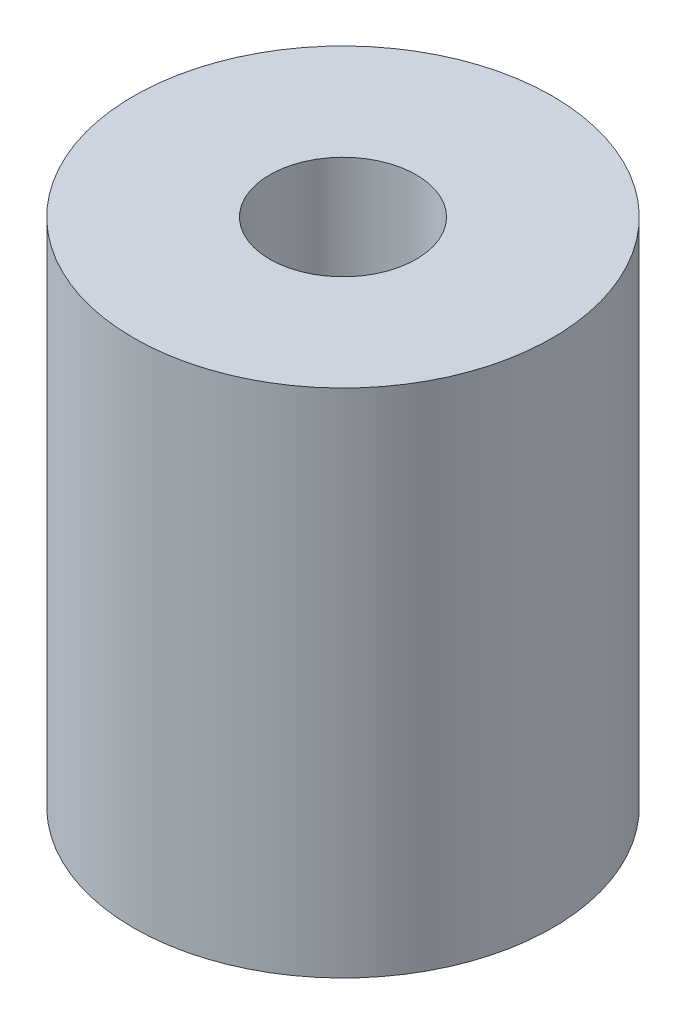
ISO-10303-21;
HEADER;
FILE_DESCRIPTION(('STEP AP214'),'2;1');
FILE_NAME('part.step','',(''),(''),'','','');
FILE_SCHEMA(('AUTOMOTIVE_DESIGN { 1 0 10303 214 1 1 1 1 }'));
ENDSEC;
DATA;
#1=APPLICATION_CONTEXT('core data for automotive mechanical design processes');
#2=APPLICATION_PROTOCOL_DEFINITION('international standard','automotive_design',2000,#1);
#3=PRODUCT_CONTEXT('',#1,'mechanical');
#4=PRODUCT('Part','Part','',(#3));
#5=PRODUCT_RELATED_PRODUCT_CATEGORY('part','',(#4));
#6=PRODUCT_DEFINITION_FORMATION('','',#4);
#7=PRODUCT_DEFINITION_CONTEXT('part definition',#1,'design');
#8=PRODUCT_DEFINITION('design','',#6,#7);
#9=PRODUCT_DEFINITION_SHAPE('','',#8);
#10=(LENGTH_UNIT() NAMED_UNIT(*) SI_UNIT(.MILLI.,.METRE.));
#11=(NAMED_UNIT(*) PLANE_ANGLE_UNIT() SI_UNIT($,.RADIAN.));
#12=(NAMED_UNIT(*) SI_UNIT($,.STERADIAN.) SOLID_ANGLE_UNIT());
#13=UNCERTAINTY_MEASURE_WITH_UNIT(LENGTH_MEASURE(1.E-05),#10,'distance_accuracy_value','');
#14=(GEOMETRIC_REPRESENTATION_CONTEXT(3) GLOBAL_UNCERTAINTY_ASSIGNED_CONTEXT((#13)) GLOBAL_UNIT_ASSIGNED_CONTEXT((#10,
#11,#12)) REPRESENTATION_CONTEXT('',''));
#15=CARTESIAN_POINT('',(0.,0.,0.));
#16=DIRECTION('',(0.,0.,1.));
#17=DIRECTION('',(1.,0.,0.));
#18=AXIS2_PLACEMENT_3D('',#15,#16,#17);
#19=CARTESIAN_POINT('',(0.,15.,0.));
#20=DIRECTION('',(0.,1.,0.));
#21=DIRECTION('',(0.,0.,1.));
#22=AXIS2_PLACEMENT_3D('',#19,#20,#21);
#23=PLANE('',#22);
#24=CARTESIAN_POINT('',(0.,15.,0.));
#25=DIRECTION('',(0.,1.,0.));
#26=DIRECTION('',(0.,0.,1.));
#27=AXIS2_PLACEMENT_3D('',#24,#25,#26);
#28=CIRCLE('',#27,6.15);
#29=CARTESIAN_POINT('',(0.,15.,6.15));
#30=VERTEX_POINT('',#29);
#31=EDGE_CURVE('E10',#30,#30,#28,.T.);
#32=ORIENTED_EDGE('',*,*,#31,.T.);
#33=EDGE_LOOP('',(#32));
#34=FACE_BOUND('',#33,.T.);
#35=CARTESIAN_POINT('',(0.,15.,0.));
#36=DIRECTION('',(0.,1.,0.));
#37=DIRECTION('',(0.,0.,1.));
#38=AXIS2_PLACEMENT_3D('',#35,#36,#37);
#39=CIRCLE('',#38,2.15);
#40=CARTESIAN_POINT('',(0.,15.,2.15));
#41=VERTEX_POINT('',#40);
#42=EDGE_CURVE('E45',#41,#41,#39,.T.);
#43=ORIENTED_EDGE('',*,*,#42,.F.);
#44=EDGE_LOOP('',(#43));
#45=FACE_BOUND('',#44,.T.);
#46=ADVANCED_FACE('F34',(#34,#45),#23,.T.);
#47=CARTESIAN_POINT('',(0.,0.,0.));
#48=DIRECTION('',(0.,1.,0.));
#49=DIRECTION('',(0.,0.,1.));
#50=AXIS2_PLACEMENT_3D('',#47,#48,#49);
#51=PLANE('',#50);
#52=CARTESIAN_POINT('',(0.,0.,0.));
#53=DIRECTION('',(0.,1.,0.));
#54=DIRECTION('',(0.,0.,1.));
#55=AXIS2_PLACEMENT_3D('',#52,#53,#54);
#56=CIRCLE('',#55,6.15);
#57=CARTESIAN_POINT('',(0.,0.,6.15));
#58=VERTEX_POINT('',#57);
#59=EDGE_CURVE('E38',#58,#58,#56,.T.);
#60=ORIENTED_EDGE('',*,*,#59,.F.);
#61=EDGE_LOOP('',(#60));
#62=FACE_BOUND('',#61,.T.);
#63=CARTESIAN_POINT('',(0.,0.,0.));
#64=DIRECTION('',(0.,1.,0.));
#65=DIRECTION('',(0.,0.,1.));
#66=AXIS2_PLACEMENT_3D('',#63,#64,#65);
#67=CIRCLE('',#66,2.15);
#68=CARTESIAN_POINT('',(0.,0.,2.15));
#69=VERTEX_POINT('',#68);
#70=EDGE_CURVE('E47',#69,#69,#67,.T.);
#71=ORIENTED_EDGE('',*,*,#70,.T.);
#72=EDGE_LOOP('',(#71));
#73=FACE_BOUND('',#72,.T.);
#74=ADVANCED_FACE('F57',(#62,#73),#51,.F.);
#75=CARTESIAN_POINT('',(0.,15.,0.));
#76=DIRECTION('',(0.,-1.,0.));
#77=DIRECTION('',(0.,0.,-1.));
#78=AXIS2_PLACEMENT_3D('',#75,#76,#77);
#79=CYLINDRICAL_SURFACE('',#78,6.15);
#80=ORIENTED_EDGE('',*,*,#31,.F.);
#81=EDGE_LOOP('',(#80));
#82=FACE_BOUND('',#81,.T.);
#83=ORIENTED_EDGE('',*,*,#59,.T.);
#84=EDGE_LOOP('',(#83));
#85=FACE_BOUND('',#84,.T.);
#86=ADVANCED_FACE('F36',(#82,#85),#79,.T.);
#87=CARTESIAN_POINT('',(0.,15.,0.));
#88=DIRECTION('',(0.,-1.,0.));
#89=DIRECTION('',(0.,0.,-1.));
#90=AXIS2_PLACEMENT_3D('',#87,#88,#89);
#91=CYLINDRICAL_SURFACE('',#90,2.15);
#92=ORIENTED_EDGE('',*,*,#42,.T.);
#93=EDGE_LOOP('',(#92));
#94=FACE_BOUND('',#93,.T.);
#95=ORIENTED_EDGE('',*,*,#70,.F.);
#96=EDGE_LOOP('',(#95));
#97=FACE_BOUND('',#96,.T.);
#98=ADVANCED_FACE('F53',(#94,#97),#91,.F.);
#99=CLOSED_SHELL('',(#46,#74,#86,#98));
#100=MANIFOLD_SOLID_BREP('B2',#99);
#101=ADVANCED_BREP_SHAPE_REPRESENTATION('',(#18,#100),#14);
#102=SHAPE_DEFINITION_REPRESENTATION(#9,#101);
ENDSEC;
END-ISO-10303-21;
